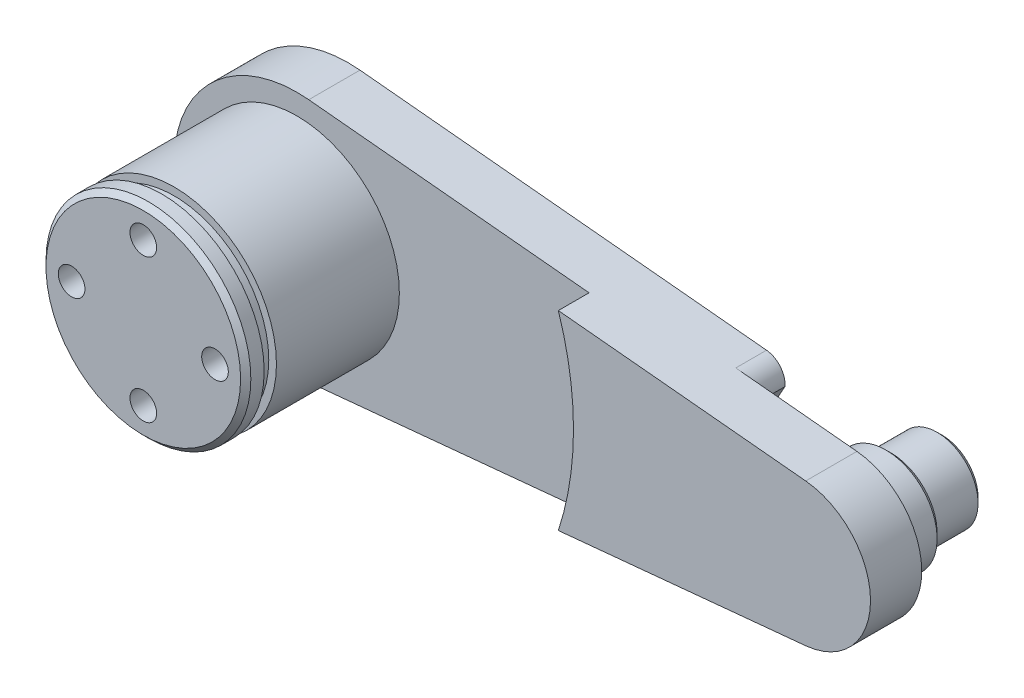
ISO-10303-21;
HEADER;
FILE_DESCRIPTION(('STEP AP214'),'2;1');
FILE_NAME('part.step','',(''),(''),'','','');
FILE_SCHEMA(('AUTOMOTIVE_DESIGN { 1 0 10303 214 1 1 1 1 }'));
ENDSEC;
DATA;
#1=APPLICATION_CONTEXT('core data for automotive mechanical design processes');
#2=APPLICATION_PROTOCOL_DEFINITION('international standard','automotive_design',2000,#1);
#3=PRODUCT_CONTEXT('',#1,'mechanical');
#4=PRODUCT('Part','Part','',(#3));
#5=PRODUCT_RELATED_PRODUCT_CATEGORY('part','',(#4));
#6=PRODUCT_DEFINITION_FORMATION('','',#4);
#7=PRODUCT_DEFINITION_CONTEXT('part definition',#1,'design');
#8=PRODUCT_DEFINITION('design','',#6,#7);
#9=PRODUCT_DEFINITION_SHAPE('','',#8);
#10=(LENGTH_UNIT() NAMED_UNIT(*) SI_UNIT(.MILLI.,.METRE.));
#11=(NAMED_UNIT(*) PLANE_ANGLE_UNIT() SI_UNIT($,.RADIAN.));
#12=(NAMED_UNIT(*) SI_UNIT($,.STERADIAN.) SOLID_ANGLE_UNIT());
#13=UNCERTAINTY_MEASURE_WITH_UNIT(LENGTH_MEASURE(1.E-05),#10,'distance_accuracy_value','');
#14=(GEOMETRIC_REPRESENTATION_CONTEXT(3) GLOBAL_UNCERTAINTY_ASSIGNED_CONTEXT((#13)) GLOBAL_UNIT_ASSIGNED_CONTEXT((#10,
#11,#12)) REPRESENTATION_CONTEXT('',''));
#15=CARTESIAN_POINT('',(0.,0.,0.));
#16=DIRECTION('',(0.,0.,1.));
#17=DIRECTION('',(1.,0.,0.));
#18=AXIS2_PLACEMENT_3D('',#15,#16,#17);
#19=CARTESIAN_POINT('',(52.,0.,-39.7212315156659));
#20=DIRECTION('',(0.,0.,1.));
#21=DIRECTION('',(1.,0.,0.));
#22=AXIS2_PLACEMENT_3D('',#19,#20,#21);
#23=CYLINDRICAL_SURFACE('',#22,11.075);
#24=CARTESIAN_POINT('',(52.,0.,3.));
#25=DIRECTION('',(0.,0.,-1.));
#26=DIRECTION('',(-1.,0.,0.));
#27=AXIS2_PLACEMENT_3D('',#24,#25,#26);
#28=CIRCLE('',#27,11.075);
#29=CARTESIAN_POINT('',(42.6444719674846,-5.92703300419511,3.));
#30=VERTEX_POINT('',#29);
#31=CARTESIAN_POINT('',(42.6444719674846,5.92703300419511,3.));
#32=VERTEX_POINT('',#31);
#33=EDGE_CURVE('E188',#30,#32,#28,.T.);
#34=ORIENTED_EDGE('',*,*,#33,.F.);
#35=DIRECTION('',(0.,0.,-1.));
#36=VECTOR('',#35,1.);
#37=CARTESIAN_POINT('',(42.6444719674846,-5.92703300419511,3.));
#38=LINE('',#37,#36);
#39=CARTESIAN_POINT('',(42.6444719674846,-5.92703300419511,0.));
#40=VERTEX_POINT('',#39);
#41=EDGE_CURVE('E235',#30,#40,#38,.T.);
#42=ORIENTED_EDGE('',*,*,#41,.T.);
#43=CARTESIAN_POINT('',(52.,0.,0.));
#44=DIRECTION('',(0.,0.,1.));
#45=DIRECTION('',(1.,0.,0.));
#46=AXIS2_PLACEMENT_3D('',#43,#44,#45);
#47=CIRCLE('',#46,11.075);
#48=CARTESIAN_POINT('',(42.6444719674846,5.92703300419511,0.));
#49=VERTEX_POINT('',#48);
#50=EDGE_CURVE('E198',#40,#49,#47,.F.);
#51=ORIENTED_EDGE('',*,*,#50,.T.);
#52=DIRECTION('',(0.,0.,-1.));
#53=VECTOR('',#52,1.);
#54=CARTESIAN_POINT('',(42.6444719674846,5.92703300419511,3.));
#55=LINE('',#54,#53);
#56=EDGE_CURVE('E231',#32,#49,#55,.T.);
#57=ORIENTED_EDGE('',*,*,#56,.F.);
#58=EDGE_LOOP('',(#34,#42,#51,#57));
#59=FACE_BOUND('',#58,.T.);
#60=ADVANCED_FACE('F51',(#59),#23,.F.);
#61=CARTESIAN_POINT('',(52.,0.,-1.));
#62=DIRECTION('',(0.,0.,-1.));
#63=DIRECTION('',(-1.,0.,0.));
#64=AXIS2_PLACEMENT_3D('',#61,#62,#63);
#65=PLANE('',#64);
#66=CARTESIAN_POINT('',(52.,0.,-1.));
#67=DIRECTION('',(0.,0.,-1.));
#68=DIRECTION('',(-1.,0.,0.));
#69=AXIS2_PLACEMENT_3D('',#66,#67,#68);
#70=CIRCLE('',#69,4.5);
#71=CARTESIAN_POINT('',(47.5,0.,-1.));
#72=VERTEX_POINT('',#71);
#73=EDGE_CURVE('E302',#72,#72,#70,.T.);
#74=ORIENTED_EDGE('',*,*,#73,.T.);
#75=EDGE_LOOP('',(#74));
#76=FACE_BOUND('',#75,.T.);
#77=CARTESIAN_POINT('',(52.,0.,-1.));
#78=DIRECTION('',(0.,0.,-1.));
#79=DIRECTION('',(-1.,0.,0.));
#80=AXIS2_PLACEMENT_3D('',#77,#78,#79);
#81=CIRCLE('',#80,4.);
#82=CARTESIAN_POINT('',(48.,0.,-1.));
#83=VERTEX_POINT('',#82);
#84=EDGE_CURVE('E254',#83,#83,#81,.T.);
#85=ORIENTED_EDGE('',*,*,#84,.F.);
#86=EDGE_LOOP('',(#85));
#87=FACE_BOUND('',#86,.T.);
#88=ADVANCED_FACE('F355',(#76,#87),#65,.T.);
#89=CARTESIAN_POINT('',(52.,0.,-1.));
#90=DIRECTION('',(0.,0.,1.));
#91=DIRECTION('',(1.,0.,0.));
#92=AXIS2_PLACEMENT_3D('',#89,#90,#91);
#93=CYLINDRICAL_SURFACE('',#92,5.);
#94=CARTESIAN_POINT('',(52.,0.,-0.500000000000003));
#95=DIRECTION('',(0.,0.,-1.));
#96=DIRECTION('',(-1.,0.,0.));
#97=AXIS2_PLACEMENT_3D('',#94,#95,#96);
#98=CIRCLE('',#97,5.);
#99=CARTESIAN_POINT('',(47.,0.,-0.500000000000003));
#100=VERTEX_POINT('',#99);
#101=EDGE_CURVE('E310',#100,#100,#98,.F.);
#102=ORIENTED_EDGE('',*,*,#101,.T.);
#103=EDGE_LOOP('',(#102));
#104=FACE_BOUND('',#103,.T.);
#105=CARTESIAN_POINT('',(52.,0.,3.));
#106=DIRECTION('',(0.,0.,-1.));
#107=DIRECTION('',(-1.,0.,0.));
#108=AXIS2_PLACEMENT_3D('',#105,#106,#107);
#109=CIRCLE('',#108,5.);
#110=CARTESIAN_POINT('',(47.,0.,3.));
#111=VERTEX_POINT('',#110);
#112=EDGE_CURVE('E230',#111,#111,#109,.F.);
#113=ORIENTED_EDGE('',*,*,#112,.F.);
#114=EDGE_LOOP('',(#113));
#115=FACE_BOUND('',#114,.T.);
#116=ADVANCED_FACE('F359',(#104,#115),#93,.T.);
#117=CARTESIAN_POINT('',(0.,0.,-6.));
#118=DIRECTION('',(0.,0.,-1.));
#119=DIRECTION('',(-1.,0.,0.));
#120=AXIS2_PLACEMENT_3D('',#117,#118,#119);
#121=PLANE('',#120);
#122=CARTESIAN_POINT('',(52.,0.,-6.));
#123=DIRECTION('',(0.,0.,-1.));
#124=DIRECTION('',(-1.,0.,0.));
#125=AXIS2_PLACEMENT_3D('',#122,#123,#124);
#126=CIRCLE('',#125,2.2);
#127=CARTESIAN_POINT('',(49.8,0.,-6.));
#128=VERTEX_POINT('',#127);
#129=EDGE_CURVE('E243',#128,#128,#126,.T.);
#130=ORIENTED_EDGE('',*,*,#129,.F.);
#131=EDGE_LOOP('',(#130));
#132=FACE_BOUND('',#131,.T.);
#133=CARTESIAN_POINT('',(52.,0.,-6.));
#134=DIRECTION('',(0.,0.,-1.));
#135=DIRECTION('',(-1.,0.,0.));
#136=AXIS2_PLACEMENT_3D('',#133,#134,#135);
#137=CIRCLE('',#136,3.5);
#138=CARTESIAN_POINT('',(48.5,0.,-6.));
#139=VERTEX_POINT('',#138);
#140=EDGE_CURVE('E309',#139,#139,#137,.T.);
#141=ORIENTED_EDGE('',*,*,#140,.T.);
#142=EDGE_LOOP('',(#141));
#143=FACE_BOUND('',#142,.T.);
#144=ADVANCED_FACE('F459',(#132,#143),#121,.T.);
#145=CARTESIAN_POINT('',(52.,0.,-6.));
#146=DIRECTION('',(0.,0.,1.));
#147=DIRECTION('',(1.,0.,0.));
#148=AXIS2_PLACEMENT_3D('',#145,#146,#147);
#149=CYLINDRICAL_SURFACE('',#148,4.);
#150=CARTESIAN_POINT('',(52.,0.,-5.50000000000001));
#151=DIRECTION('',(0.,0.,-1.));
#152=DIRECTION('',(-1.,0.,0.));
#153=AXIS2_PLACEMENT_3D('',#150,#151,#152);
#154=CIRCLE('',#153,4.);
#155=CARTESIAN_POINT('',(48.,0.,-5.50000000000001));
#156=VERTEX_POINT('',#155);
#157=EDGE_CURVE('E312',#156,#156,#154,.F.);
#158=ORIENTED_EDGE('',*,*,#157,.T.);
#159=EDGE_LOOP('',(#158));
#160=FACE_BOUND('',#159,.T.);
#161=ORIENTED_EDGE('',*,*,#84,.T.);
#162=EDGE_LOOP('',(#161));
#163=FACE_BOUND('',#162,.T.);
#164=ADVANCED_FACE('F437',(#160,#163),#149,.T.);
#165=CARTESIAN_POINT('',(52.,0.,-1.));
#166=DIRECTION('',(0.,0.,1.));
#167=DIRECTION('',(1.,0.,0.));
#168=AXIS2_PLACEMENT_3D('',#165,#166,#167);
#169=CONICAL_SURFACE('',#168,4.5,0.785398163397445);
#170=ORIENTED_EDGE('',*,*,#101,.F.);
#171=EDGE_LOOP('',(#170));
#172=FACE_BOUND('',#171,.T.);
#173=ORIENTED_EDGE('',*,*,#73,.F.);
#174=EDGE_LOOP('',(#173));
#175=FACE_BOUND('',#174,.T.);
#176=ADVANCED_FACE('F435',(#172,#175),#169,.T.);
#177=CARTESIAN_POINT('',(52.,0.,-6.));
#178=DIRECTION('',(0.,0.,1.));
#179=DIRECTION('',(1.,0.,0.));
#180=AXIS2_PLACEMENT_3D('',#177,#178,#179);
#181=CONICAL_SURFACE('',#180,3.5,0.785398163397448);
#182=ORIENTED_EDGE('',*,*,#157,.F.);
#183=EDGE_LOOP('',(#182));
#184=FACE_BOUND('',#183,.T.);
#185=ORIENTED_EDGE('',*,*,#140,.F.);
#186=EDGE_LOOP('',(#185));
#187=FACE_BOUND('',#186,.T.);
#188=ADVANCED_FACE('F438',(#184,#187),#181,.T.);
#189=CARTESIAN_POINT('',(52.,0.,4.));
#190=DIRECTION('',(0.,0.,-1.));
#191=DIRECTION('',(-1.,0.,0.));
#192=AXIS2_PLACEMENT_3D('',#189,#190,#191);
#193=CYLINDRICAL_SURFACE('',#192,2.2);
#194=CARTESIAN_POINT('',(52.,0.,4.));
#195=DIRECTION('',(0.,0.,-1.));
#196=DIRECTION('',(-1.,0.,0.));
#197=AXIS2_PLACEMENT_3D('',#194,#195,#196);
#198=CIRCLE('',#197,2.2);
#199=CARTESIAN_POINT('',(49.8,0.,4.));
#200=VERTEX_POINT('',#199);
#201=EDGE_CURVE('E242',#200,#200,#198,.T.);
#202=ORIENTED_EDGE('',*,*,#201,.F.);
#203=EDGE_LOOP('',(#202));
#204=FACE_BOUND('',#203,.T.);
#205=ORIENTED_EDGE('',*,*,#129,.T.);
#206=EDGE_LOOP('',(#205));
#207=FACE_BOUND('',#206,.T.);
#208=ADVANCED_FACE('F443',(#204,#207),#193,.F.);
#209=CARTESIAN_POINT('',(52.,0.,4.));
#210=DIRECTION('',(0.,0.,-1.));
#211=DIRECTION('',(-1.,0.,0.));
#212=AXIS2_PLACEMENT_3D('',#209,#210,#211);
#213=PLANE('',#212);
#214=ORIENTED_EDGE('',*,*,#201,.T.);
#215=EDGE_LOOP('',(#214));
#216=FACE_BOUND('',#215,.T.);
#217=ADVANCED_FACE('F448',(#216),#213,.T.);
#218=CARTESIAN_POINT('',(0.,0.,3.));
#219=DIRECTION('',(0.,0.,-1.));
#220=DIRECTION('',(-1.,0.,0.));
#221=AXIS2_PLACEMENT_3D('',#218,#219,#220);
#222=PLANE('',#221);
#223=ORIENTED_EDGE('',*,*,#33,.T.);
#224=CARTESIAN_POINT('',(40.6537389990834,6.1193406965028,3.));
#225=DIRECTION('',(0.,0.,-1.));
#226=DIRECTION('',(-1.,0.,0.));
#227=AXIS2_PLACEMENT_3D('',#224,#225,#226);
#228=CIRCLE('',#227,2.);
#229=CARTESIAN_POINT('',(40.8460466913911,8.11007366490396,3.));
#230=VERTEX_POINT('',#229);
#231=EDGE_CURVE('E11',#32,#230,#228,.F.);
#232=ORIENTED_EDGE('',*,*,#231,.T.);
#233=DIRECTION('',(-0.99536648420058,0.0961538461538461,0.));
#234=VECTOR('',#233,1.);
#235=CARTESIAN_POINT('',(1.15384615384615,11.944397810407,3.));
#236=LINE('',#235,#234);
#237=CARTESIAN_POINT('',(52.6730769230769,6.96756538940406,3.));
#238=VERTEX_POINT('',#237);
#239=EDGE_CURVE('E236',#238,#230,#236,.T.);
#240=ORIENTED_EDGE('',*,*,#239,.F.);
#241=CARTESIAN_POINT('',(52.,0.,3.));
#242=DIRECTION('',(0.,0.,-1.));
#243=DIRECTION('',(-1.,0.,0.));
#244=AXIS2_PLACEMENT_3D('',#241,#242,#243);
#245=CIRCLE('',#244,7.);
#246=CARTESIAN_POINT('',(52.6730769230769,-6.96756538940406,3.));
#247=VERTEX_POINT('',#246);
#248=EDGE_CURVE('E162',#238,#247,#245,.T.);
#249=ORIENTED_EDGE('',*,*,#248,.T.);
#250=DIRECTION('',(-0.99536648420058,-0.0961538461538461,0.));
#251=VECTOR('',#250,1.);
#252=CARTESIAN_POINT('',(1.15384615384615,-11.944397810407,3.));
#253=LINE('',#252,#251);
#254=CARTESIAN_POINT('',(40.8460466913911,-8.11007366490396,3.));
#255=VERTEX_POINT('',#254);
#256=EDGE_CURVE('E241',#247,#255,#253,.T.);
#257=ORIENTED_EDGE('',*,*,#256,.T.);
#258=CARTESIAN_POINT('',(40.6537389990834,-6.1193406965028,3.));
#259=DIRECTION('',(0.,0.,-1.));
#260=DIRECTION('',(-1.,0.,0.));
#261=AXIS2_PLACEMENT_3D('',#258,#259,#260);
#262=CIRCLE('',#261,2.);
#263=EDGE_CURVE('E58',#255,#30,#262,.F.);
#264=ORIENTED_EDGE('',*,*,#263,.T.);
#265=EDGE_LOOP('',(#223,#232,#240,#249,#257,#264));
#266=FACE_BOUND('',#265,.T.);
#267=ORIENTED_EDGE('',*,*,#112,.T.);
#268=EDGE_LOOP('',(#267));
#269=FACE_BOUND('',#268,.T.);
#270=ADVANCED_FACE('F471',(#266,#269),#222,.T.);
#271=CARTESIAN_POINT('',(0.,0.,20.));
#272=DIRECTION('',(0.,0.,-1.));
#273=DIRECTION('',(-1.,0.,0.));
#274=AXIS2_PLACEMENT_3D('',#271,#272,#273);
#275=CYLINDRICAL_SURFACE('',#274,10.);
#276=CARTESIAN_POINT('',(0.,0.,17.));
#277=DIRECTION('',(0.,0.,-1.));
#278=DIRECTION('',(-1.,0.,0.));
#279=AXIS2_PLACEMENT_3D('',#276,#277,#278);
#280=CIRCLE('',#279,10.);
#281=CARTESIAN_POINT('',(-10.,0.,17.));
#282=VERTEX_POINT('',#281);
#283=EDGE_CURVE('E226',#282,#282,#280,.T.);
#284=ORIENTED_EDGE('',*,*,#283,.T.);
#285=EDGE_LOOP('',(#284));
#286=FACE_BOUND('',#285,.T.);
#287=CARTESIAN_POINT('',(0.,0.,5.));
#288=DIRECTION('',(0.,0.,1.));
#289=DIRECTION('',(1.,0.,0.));
#290=AXIS2_PLACEMENT_3D('',#287,#288,#289);
#291=CIRCLE('',#290,10.);
#292=CARTESIAN_POINT('',(10.,0.,5.));
#293=VERTEX_POINT('',#292);
#294=EDGE_CURVE('E280',#293,#293,#291,.T.);
#295=ORIENTED_EDGE('',*,*,#294,.T.);
#296=EDGE_LOOP('',(#295));
#297=FACE_BOUND('',#296,.T.);
#298=ADVANCED_FACE('F390',(#286,#297),#275,.T.);
#299=CARTESIAN_POINT('',(0.,0.,5.));
#300=DIRECTION('',(0.,0.,-1.));
#301=DIRECTION('',(-1.,0.,0.));
#302=AXIS2_PLACEMENT_3D('',#299,#300,#301);
#303=CYLINDRICAL_SURFACE('',#302,12.);
#304=DIRECTION('',(0.,0.,-1.));
#305=VECTOR('',#304,1.);
#306=CARTESIAN_POINT('',(1.15384615384615,11.944397810407,5.));
#307=LINE('',#306,#305);
#308=CARTESIAN_POINT('',(1.15384615384615,11.944397810407,5.));
#309=VERTEX_POINT('',#308);
#310=CARTESIAN_POINT('',(1.15384615384615,11.944397810407,0.));
#311=VERTEX_POINT('',#310);
#312=EDGE_CURVE('E168',#309,#311,#307,.T.);
#313=ORIENTED_EDGE('',*,*,#312,.T.);
#314=CARTESIAN_POINT('',(0.,0.,0.));
#315=DIRECTION('',(0.,0.,1.));
#316=DIRECTION('',(1.,0.,0.));
#317=AXIS2_PLACEMENT_3D('',#314,#315,#316);
#318=CIRCLE('',#317,12.);
#319=CARTESIAN_POINT('',(1.15384615384615,-11.944397810407,0.));
#320=VERTEX_POINT('',#319);
#321=EDGE_CURVE('E285',#311,#320,#318,.T.);
#322=ORIENTED_EDGE('',*,*,#321,.T.);
#323=DIRECTION('',(0.,0.,-1.));
#324=VECTOR('',#323,1.);
#325=CARTESIAN_POINT('',(1.15384615384615,-11.944397810407,5.));
#326=LINE('',#325,#324);
#327=CARTESIAN_POINT('',(1.15384615384615,-11.944397810407,5.));
#328=VERTEX_POINT('',#327);
#329=EDGE_CURVE('E288',#328,#320,#326,.T.);
#330=ORIENTED_EDGE('',*,*,#329,.F.);
#331=CARTESIAN_POINT('',(0.,0.,5.));
#332=DIRECTION('',(0.,0.,1.));
#333=DIRECTION('',(1.,0.,0.));
#334=AXIS2_PLACEMENT_3D('',#331,#332,#333);
#335=CIRCLE('',#334,12.);
#336=EDGE_CURVE('E287',#309,#328,#335,.T.);
#337=ORIENTED_EDGE('',*,*,#336,.F.);
#338=EDGE_LOOP('',(#313,#322,#330,#337));
#339=FACE_BOUND('',#338,.T.);
#340=ADVANCED_FACE('F417',(#339),#303,.T.);
#341=CARTESIAN_POINT('',(0.,0.,5.));
#342=DIRECTION('',(0.,0.,1.));
#343=DIRECTION('',(1.,0.,0.));
#344=AXIS2_PLACEMENT_3D('',#341,#342,#343);
#345=PLANE('',#344);
#346=CARTESIAN_POINT('',(0.,0.,5.));
#347=DIRECTION('',(0.,0.,-1.));
#348=DIRECTION('',(1.,0.,0.));
#349=AXIS2_PLACEMENT_3D('',#346,#347,#348);
#350=CIRCLE('',#349,30.);
#351=CARTESIAN_POINT('',(28.5218997022735,9.30060414024013,5.));
#352=VERTEX_POINT('',#351);
#353=CARTESIAN_POINT('',(28.5218997022735,-9.30060414024012,5.));
#354=VERTEX_POINT('',#353);
#355=EDGE_CURVE('E67',#352,#354,#350,.T.);
#356=ORIENTED_EDGE('',*,*,#355,.F.);
#357=DIRECTION('',(0.99536648420058,-0.0961538461538461,0.));
#358=VECTOR('',#357,1.);
#359=CARTESIAN_POINT('',(1.15384615384615,11.944397810407,5.));
#360=LINE('',#359,#358);
#361=EDGE_CURVE('E282',#309,#352,#360,.T.);
#362=ORIENTED_EDGE('',*,*,#361,.F.);
#363=ORIENTED_EDGE('',*,*,#336,.T.);
#364=DIRECTION('',(0.99536648420058,0.0961538461538461,0.));
#365=VECTOR('',#364,1.);
#366=CARTESIAN_POINT('',(1.15384615384615,-11.944397810407,5.));
#367=LINE('',#366,#365);
#368=EDGE_CURVE('E283',#328,#354,#367,.T.);
#369=ORIENTED_EDGE('',*,*,#368,.T.);
#370=EDGE_LOOP('',(#356,#362,#363,#369));
#371=FACE_BOUND('',#370,.T.);
#372=ORIENTED_EDGE('',*,*,#294,.F.);
#373=EDGE_LOOP('',(#372));
#374=FACE_BOUND('',#373,.T.);
#375=ADVANCED_FACE('F411',(#371,#374),#345,.T.);
#376=CARTESIAN_POINT('',(1.15384615384615,11.944397810407,5.));
#377=DIRECTION('',(0.0961538461538461,0.99536648420058,0.));
#378=DIRECTION('',(-0.99536648420058,0.0961538461538461,0.));
#379=AXIS2_PLACEMENT_3D('',#376,#377,#378);
#380=PLANE('',#379);
#381=ORIENTED_EDGE('',*,*,#239,.T.);
#382=DIRECTION('',(0.,0.,1.));
#383=VECTOR('',#382,1.);
#384=CARTESIAN_POINT('',(40.8460466913911,8.11007366490396,0.));
#385=LINE('',#384,#383);
#386=CARTESIAN_POINT('',(40.8460466913911,8.11007366490396,0.));
#387=VERTEX_POINT('',#386);
#388=EDGE_CURVE('E321',#230,#387,#385,.F.);
#389=ORIENTED_EDGE('',*,*,#388,.T.);
#390=DIRECTION('',(0.99536648420058,-0.0961538461538461,0.));
#391=VECTOR('',#390,1.);
#392=CARTESIAN_POINT('',(1.15384615384615,11.944397810407,0.));
#393=LINE('',#392,#391);
#394=EDGE_CURVE('E293',#311,#387,#393,.T.);
#395=ORIENTED_EDGE('',*,*,#394,.F.);
#396=ORIENTED_EDGE('',*,*,#312,.F.);
#397=ORIENTED_EDGE('',*,*,#361,.T.);
#398=DIRECTION('',(0.,0.,-1.));
#399=VECTOR('',#398,1.);
#400=CARTESIAN_POINT('',(28.5218997022735,9.30060414024013,8.));
#401=LINE('',#400,#399);
#402=CARTESIAN_POINT('',(28.5218997022735,9.30060414024013,8.));
#403=VERTEX_POINT('',#402);
#404=EDGE_CURVE('E175',#403,#352,#401,.T.);
#405=ORIENTED_EDGE('',*,*,#404,.F.);
#406=DIRECTION('',(-0.99536648420058,0.096153846153846,0.));
#407=VECTOR('',#406,1.);
#408=CARTESIAN_POINT('',(52.6730769230769,6.96756538940406,8.));
#409=LINE('',#408,#407);
#410=CARTESIAN_POINT('',(52.6730769230769,6.96756538940406,8.));
#411=VERTEX_POINT('',#410);
#412=EDGE_CURVE('E169',#411,#403,#409,.T.);
#413=ORIENTED_EDGE('',*,*,#412,.F.);
#414=DIRECTION('',(0.,0.,-1.));
#415=VECTOR('',#414,1.);
#416=CARTESIAN_POINT('',(52.6730769230769,6.96756538940406,5.));
#417=LINE('',#416,#415);
#418=EDGE_CURVE('E157',#411,#238,#417,.T.);
#419=ORIENTED_EDGE('',*,*,#418,.T.);
#420=EDGE_LOOP('',(#381,#389,#395,#396,#397,#405,#413,#419));
#421=FACE_BOUND('',#420,.T.);
#422=ADVANCED_FACE('F167',(#421),#380,.T.);
#423=CARTESIAN_POINT('',(52.,0.,5.));
#424=DIRECTION('',(0.,0.,-1.));
#425=DIRECTION('',(-1.,0.,0.));
#426=AXIS2_PLACEMENT_3D('',#423,#424,#425);
#427=CYLINDRICAL_SURFACE('',#426,7.);
#428=DIRECTION('',(0.,0.,-1.));
#429=VECTOR('',#428,1.);
#430=CARTESIAN_POINT('',(52.6730769230769,-6.96756538940406,5.));
#431=LINE('',#430,#429);
#432=CARTESIAN_POINT('',(52.6730769230769,-6.96756538940406,8.));
#433=VERTEX_POINT('',#432);
#434=EDGE_CURVE('E164',#433,#247,#431,.T.);
#435=ORIENTED_EDGE('',*,*,#434,.T.);
#436=ORIENTED_EDGE('',*,*,#248,.F.);
#437=ORIENTED_EDGE('',*,*,#418,.F.);
#438=CARTESIAN_POINT('',(52.,0.,8.));
#439=DIRECTION('',(0.,0.,1.));
#440=DIRECTION('',(1.,0.,0.));
#441=AXIS2_PLACEMENT_3D('',#438,#439,#440);
#442=CIRCLE('',#441,7.);
#443=EDGE_CURVE('E156',#433,#411,#442,.T.);
#444=ORIENTED_EDGE('',*,*,#443,.F.);
#445=EDGE_LOOP('',(#435,#436,#437,#444));
#446=FACE_BOUND('',#445,.T.);
#447=ADVANCED_FACE('F158',(#446),#427,.T.);
#448=CARTESIAN_POINT('',(1.15384615384615,-11.944397810407,5.));
#449=DIRECTION('',(-0.0961538461538461,0.99536648420058,0.));
#450=DIRECTION('',(-0.99536648420058,-0.0961538461538461,0.));
#451=AXIS2_PLACEMENT_3D('',#448,#449,#450);
#452=PLANE('',#451);
#453=DIRECTION('',(0.99536648420058,0.0961538461538461,0.));
#454=VECTOR('',#453,1.);
#455=CARTESIAN_POINT('',(1.15384615384615,-11.944397810407,0.));
#456=LINE('',#455,#454);
#457=CARTESIAN_POINT('',(40.8460466913911,-8.11007366490396,0.));
#458=VERTEX_POINT('',#457);
#459=EDGE_CURVE('E278',#320,#458,#456,.T.);
#460=ORIENTED_EDGE('',*,*,#459,.T.);
#461=DIRECTION('',(0.,0.,-1.));
#462=VECTOR('',#461,1.);
#463=CARTESIAN_POINT('',(40.8460466913911,-8.11007366490396,5.));
#464=LINE('',#463,#462);
#465=EDGE_CURVE('E317',#458,#255,#464,.F.);
#466=ORIENTED_EDGE('',*,*,#465,.T.);
#467=ORIENTED_EDGE('',*,*,#256,.F.);
#468=ORIENTED_EDGE('',*,*,#434,.F.);
#469=DIRECTION('',(0.99536648420058,0.096153846153846,0.));
#470=VECTOR('',#469,1.);
#471=CARTESIAN_POINT('',(28.5218997022735,-9.30060414024012,8.));
#472=LINE('',#471,#470);
#473=CARTESIAN_POINT('',(28.5218997022735,-9.30060414024012,8.));
#474=VERTEX_POINT('',#473);
#475=EDGE_CURVE('E179',#474,#433,#472,.T.);
#476=ORIENTED_EDGE('',*,*,#475,.F.);
#477=DIRECTION('',(0.,0.,-1.));
#478=VECTOR('',#477,1.);
#479=CARTESIAN_POINT('',(28.5218997022735,-9.30060414024012,8.));
#480=LINE('',#479,#478);
#481=EDGE_CURVE('E184',#474,#354,#480,.T.);
#482=ORIENTED_EDGE('',*,*,#481,.T.);
#483=ORIENTED_EDGE('',*,*,#368,.F.);
#484=ORIENTED_EDGE('',*,*,#329,.T.);
#485=EDGE_LOOP('',(#460,#466,#467,#468,#476,#482,#483,#484));
#486=FACE_BOUND('',#485,.T.);
#487=ADVANCED_FACE('F405',(#486),#452,.F.);
#488=CARTESIAN_POINT('',(0.,0.,0.));
#489=DIRECTION('',(0.,0.,1.));
#490=DIRECTION('',(1.,0.,0.));
#491=AXIS2_PLACEMENT_3D('',#488,#489,#490);
#492=PLANE('',#491);
#493=ORIENTED_EDGE('',*,*,#50,.F.);
#494=CARTESIAN_POINT('',(40.6537389990834,-6.1193406965028,0.));
#495=DIRECTION('',(0.,0.,1.));
#496=DIRECTION('',(1.,0.,0.));
#497=AXIS2_PLACEMENT_3D('',#494,#495,#496);
#498=CIRCLE('',#497,2.);
#499=EDGE_CURVE('E323',#40,#458,#498,.F.);
#500=ORIENTED_EDGE('',*,*,#499,.T.);
#501=ORIENTED_EDGE('',*,*,#459,.F.);
#502=ORIENTED_EDGE('',*,*,#321,.F.);
#503=ORIENTED_EDGE('',*,*,#394,.T.);
#504=CARTESIAN_POINT('',(40.6537389990834,6.1193406965028,0.));
#505=DIRECTION('',(0.,0.,1.));
#506=DIRECTION('',(1.,0.,0.));
#507=AXIS2_PLACEMENT_3D('',#504,#505,#506);
#508=CIRCLE('',#507,2.);
#509=EDGE_CURVE('E316',#387,#49,#508,.F.);
#510=ORIENTED_EDGE('',*,*,#509,.T.);
#511=EDGE_LOOP('',(#493,#500,#501,#502,#503,#510));
#512=FACE_BOUND('',#511,.T.);
#513=DIRECTION('',(-0.99536648420058,0.0961538461538463,0.));
#514=VECTOR('',#513,1.);
#515=CARTESIAN_POINT('',(15.3405939053912,4.54600688845431,0.));
#516=LINE('',#515,#514);
#517=CARTESIAN_POINT('',(38.6444719674846,2.2948184653579,0.));
#518=VERTEX_POINT('',#517);
#519=CARTESIAN_POINT('',(15.3405939053912,4.54600688845431,0.));
#520=VERTEX_POINT('',#519);
#521=EDGE_CURVE('E210',#518,#520,#516,.T.);
#522=ORIENTED_EDGE('',*,*,#521,.T.);
#523=CARTESIAN_POINT('',(0.,0.,0.));
#524=DIRECTION('',(0.,0.,1.));
#525=DIRECTION('',(1.,0.,0.));
#526=AXIS2_PLACEMENT_3D('',#523,#524,#525);
#527=CIRCLE('',#526,16.);
#528=CARTESIAN_POINT('',(15.3405939053912,-4.54600688845431,0.));
#529=VERTEX_POINT('',#528);
#530=EDGE_CURVE('E204',#520,#529,#527,.F.);
#531=ORIENTED_EDGE('',*,*,#530,.T.);
#532=DIRECTION('',(0.99536648420058,0.0961538461538462,0.));
#533=VECTOR('',#532,1.);
#534=CARTESIAN_POINT('',(38.6444719674846,-2.2948184653579,0.));
#535=LINE('',#534,#533);
#536=CARTESIAN_POINT('',(38.6444719674846,-2.2948184653579,0.));
#537=VERTEX_POINT('',#536);
#538=EDGE_CURVE('E207',#529,#537,#535,.T.);
#539=ORIENTED_EDGE('',*,*,#538,.T.);
#540=DIRECTION('',(0.,1.,0.));
#541=VECTOR('',#540,1.);
#542=CARTESIAN_POINT('',(38.6444719674846,2.2948184653579,0.));
#543=LINE('',#542,#541);
#544=EDGE_CURVE('E220',#537,#518,#543,.T.);
#545=ORIENTED_EDGE('',*,*,#544,.T.);
#546=EDGE_LOOP('',(#522,#531,#539,#545));
#547=FACE_BOUND('',#546,.T.);
#548=ADVANCED_FACE('F396',(#512,#547),#492,.F.);
#549=CARTESIAN_POINT('',(40.6537389990834,-6.1193406965028,3.));
#550=DIRECTION('',(0.,0.,-1.));
#551=DIRECTION('',(-1.,0.,0.));
#552=AXIS2_PLACEMENT_3D('',#549,#550,#551);
#553=CYLINDRICAL_SURFACE('',#552,2.);
#554=ORIENTED_EDGE('',*,*,#499,.F.);
#555=ORIENTED_EDGE('',*,*,#41,.F.);
#556=ORIENTED_EDGE('',*,*,#263,.F.);
#557=ORIENTED_EDGE('',*,*,#465,.F.);
#558=EDGE_LOOP('',(#554,#555,#556,#557));
#559=FACE_BOUND('',#558,.T.);
#560=ADVANCED_FACE('F347',(#559),#553,.T.);
#561=CARTESIAN_POINT('',(40.6537389990834,6.1193406965028,3.));
#562=DIRECTION('',(0.,0.,-1.));
#563=DIRECTION('',(-1.,0.,0.));
#564=AXIS2_PLACEMENT_3D('',#561,#562,#563);
#565=CYLINDRICAL_SURFACE('',#564,2.);
#566=ORIENTED_EDGE('',*,*,#509,.F.);
#567=ORIENTED_EDGE('',*,*,#388,.F.);
#568=ORIENTED_EDGE('',*,*,#231,.F.);
#569=ORIENTED_EDGE('',*,*,#56,.T.);
#570=EDGE_LOOP('',(#566,#567,#568,#569));
#571=FACE_BOUND('',#570,.T.);
#572=ADVANCED_FACE('F52',(#571),#565,.T.);
#573=CARTESIAN_POINT('',(9.25,0.,18.2));
#574=DIRECTION('',(0.,0.,1.));
#575=DIRECTION('',(1.,0.,0.));
#576=AXIS2_PLACEMENT_3D('',#573,#574,#575);
#577=PLANE('',#576);
#578=CARTESIAN_POINT('',(0.,0.,18.2));
#579=DIRECTION('',(0.,0.,1.));
#580=DIRECTION('',(1.,0.,0.));
#581=AXIS2_PLACEMENT_3D('',#578,#579,#580);
#582=CIRCLE('',#581,9.25);
#583=CARTESIAN_POINT('',(9.25,0.,18.2));
#584=VERTEX_POINT('',#583);
#585=EDGE_CURVE('E221',#584,#584,#582,.T.);
#586=ORIENTED_EDGE('',*,*,#585,.T.);
#587=EDGE_LOOP('',(#586));
#588=FACE_BOUND('',#587,.T.);
#589=CARTESIAN_POINT('',(0.,0.,18.2));
#590=DIRECTION('',(0.,0.,1.));
#591=DIRECTION('',(1.,0.,0.));
#592=AXIS2_PLACEMENT_3D('',#589,#590,#591);
#593=CIRCLE('',#592,10.);
#594=CARTESIAN_POINT('',(10.,0.,18.2));
#595=VERTEX_POINT('',#594);
#596=EDGE_CURVE('E54',#595,#595,#593,.T.);
#597=ORIENTED_EDGE('',*,*,#596,.F.);
#598=EDGE_LOOP('',(#597));
#599=FACE_BOUND('',#598,.T.);
#600=ADVANCED_FACE('F331',(#588,#599),#577,.F.);
#601=CARTESIAN_POINT('',(9.25,0.,17.));
#602=DIRECTION('',(0.,0.,-1.));
#603=DIRECTION('',(-1.,0.,0.));
#604=AXIS2_PLACEMENT_3D('',#601,#602,#603);
#605=PLANE('',#604);
#606=CARTESIAN_POINT('',(0.,0.,17.));
#607=DIRECTION('',(0.,0.,1.));
#608=DIRECTION('',(1.,0.,0.));
#609=AXIS2_PLACEMENT_3D('',#606,#607,#608);
#610=CIRCLE('',#609,9.25);
#611=CARTESIAN_POINT('',(9.25,0.,17.));
#612=VERTEX_POINT('',#611);
#613=EDGE_CURVE('E222',#612,#612,#610,.T.);
#614=ORIENTED_EDGE('',*,*,#613,.F.);
#615=EDGE_LOOP('',(#614));
#616=FACE_BOUND('',#615,.T.);
#617=ORIENTED_EDGE('',*,*,#283,.F.);
#618=EDGE_LOOP('',(#617));
#619=FACE_BOUND('',#618,.T.);
#620=ADVANCED_FACE('F340',(#616,#619),#605,.F.);
#621=CARTESIAN_POINT('',(0.,0.,20.));
#622=DIRECTION('',(0.,0.,1.));
#623=DIRECTION('',(1.,0.,0.));
#624=AXIS2_PLACEMENT_3D('',#621,#622,#623);
#625=CYLINDRICAL_SURFACE('',#624,9.25);
#626=ORIENTED_EDGE('',*,*,#585,.F.);
#627=EDGE_LOOP('',(#626));
#628=FACE_BOUND('',#627,.T.);
#629=ORIENTED_EDGE('',*,*,#613,.T.);
#630=EDGE_LOOP('',(#629));
#631=FACE_BOUND('',#630,.T.);
#632=ADVANCED_FACE('F344',(#628,#631),#625,.T.);
#633=CARTESIAN_POINT('',(-7.,0.,14.));
#634=DIRECTION('',(0.,0.,1.));
#635=DIRECTION('',(1.,0.,0.));
#636=AXIS2_PLACEMENT_3D('',#633,#634,#635);
#637=PLANE('',#636);
#638=CARTESIAN_POINT('',(-7.,0.,14.));
#639=DIRECTION('',(0.,0.,1.));
#640=DIRECTION('',(1.,0.,0.));
#641=AXIS2_PLACEMENT_3D('',#638,#639,#640);
#642=CIRCLE('',#641,1.3);
#643=CARTESIAN_POINT('',(-5.7,0.,14.));
#644=VERTEX_POINT('',#643);
#645=EDGE_CURVE('E250',#644,#644,#642,.T.);
#646=ORIENTED_EDGE('',*,*,#645,.T.);
#647=EDGE_LOOP('',(#646));
#648=FACE_BOUND('',#647,.T.);
#649=ADVANCED_FACE('F546',(#648),#637,.T.);
#650=CARTESIAN_POINT('',(0.,-7.,14.));
#651=DIRECTION('',(0.,0.,1.));
#652=DIRECTION('',(1.,0.,0.));
#653=AXIS2_PLACEMENT_3D('',#650,#651,#652);
#654=PLANE('',#653);
#655=CARTESIAN_POINT('',(0.,-7.,14.));
#656=DIRECTION('',(0.,0.,1.));
#657=DIRECTION('',(1.,0.,0.));
#658=AXIS2_PLACEMENT_3D('',#655,#656,#657);
#659=CIRCLE('',#658,1.3);
#660=CARTESIAN_POINT('',(1.29999999999995,-7.,14.));
#661=VERTEX_POINT('',#660);
#662=EDGE_CURVE('E267',#661,#661,#659,.T.);
#663=ORIENTED_EDGE('',*,*,#662,.T.);
#664=EDGE_LOOP('',(#663));
#665=FACE_BOUND('',#664,.T.);
#666=ADVANCED_FACE('F648',(#665),#654,.T.);
#667=CARTESIAN_POINT('',(7.,0.,14.));
#668=DIRECTION('',(0.,0.,1.));
#669=DIRECTION('',(1.,0.,0.));
#670=AXIS2_PLACEMENT_3D('',#667,#668,#669);
#671=PLANE('',#670);
#672=CARTESIAN_POINT('',(7.,0.,14.));
#673=DIRECTION('',(0.,0.,1.));
#674=DIRECTION('',(1.,0.,0.));
#675=AXIS2_PLACEMENT_3D('',#672,#673,#674);
#676=CIRCLE('',#675,1.3);
#677=CARTESIAN_POINT('',(8.3,0.,14.));
#678=VERTEX_POINT('',#677);
#679=EDGE_CURVE('E257',#678,#678,#676,.T.);
#680=ORIENTED_EDGE('',*,*,#679,.T.);
#681=EDGE_LOOP('',(#680));
#682=FACE_BOUND('',#681,.T.);
#683=ADVANCED_FACE('F628',(#682),#671,.T.);
#684=CARTESIAN_POINT('',(0.,7.,14.));
#685=DIRECTION('',(0.,0.,1.));
#686=DIRECTION('',(1.,0.,0.));
#687=AXIS2_PLACEMENT_3D('',#684,#685,#686);
#688=PLANE('',#687);
#689=CARTESIAN_POINT('',(0.,7.,14.));
#690=DIRECTION('',(0.,0.,1.));
#691=DIRECTION('',(1.,0.,0.));
#692=AXIS2_PLACEMENT_3D('',#689,#690,#691);
#693=CIRCLE('',#692,1.3);
#694=CARTESIAN_POINT('',(1.3,7.,14.));
#695=VERTEX_POINT('',#694);
#696=EDGE_CURVE('E249',#695,#695,#693,.T.);
#697=ORIENTED_EDGE('',*,*,#696,.T.);
#698=EDGE_LOOP('',(#697));
#699=FACE_BOUND('',#698,.T.);
#700=ADVANCED_FACE('F621',(#699),#688,.T.);
#701=CARTESIAN_POINT('',(-7.,0.,14.));
#702=DIRECTION('',(0.,0.,1.));
#703=DIRECTION('',(1.,0.,0.));
#704=AXIS2_PLACEMENT_3D('',#701,#702,#703);
#705=CYLINDRICAL_SURFACE('',#704,1.3);
#706=ORIENTED_EDGE('',*,*,#645,.F.);
#707=EDGE_LOOP('',(#706));
#708=FACE_BOUND('',#707,.T.);
#709=CARTESIAN_POINT('',(-7.,0.,20.));
#710=DIRECTION('',(0.,0.,1.));
#711=DIRECTION('',(1.,0.,0.));
#712=AXIS2_PLACEMENT_3D('',#709,#710,#711);
#713=CIRCLE('',#712,1.3);
#714=CARTESIAN_POINT('',(-5.7,0.,20.));
#715=VERTEX_POINT('',#714);
#716=EDGE_CURVE('E269',#715,#715,#713,.T.);
#717=ORIENTED_EDGE('',*,*,#716,.T.);
#718=EDGE_LOOP('',(#717));
#719=FACE_BOUND('',#718,.T.);
#720=ADVANCED_FACE('F630',(#708,#719),#705,.F.);
#721=CARTESIAN_POINT('',(0.,-7.,14.));
#722=DIRECTION('',(0.,0.,1.));
#723=DIRECTION('',(1.,0.,0.));
#724=AXIS2_PLACEMENT_3D('',#721,#722,#723);
#725=CYLINDRICAL_SURFACE('',#724,1.3);
#726=ORIENTED_EDGE('',*,*,#662,.F.);
#727=EDGE_LOOP('',(#726));
#728=FACE_BOUND('',#727,.T.);
#729=CARTESIAN_POINT('',(0.,-7.,20.));
#730=DIRECTION('',(0.,0.,1.));
#731=DIRECTION('',(1.,0.,0.));
#732=AXIS2_PLACEMENT_3D('',#729,#730,#731);
#733=CIRCLE('',#732,1.3);
#734=CARTESIAN_POINT('',(1.29999999999995,-7.,20.));
#735=VERTEX_POINT('',#734);
#736=EDGE_CURVE('E262',#735,#735,#733,.T.);
#737=ORIENTED_EDGE('',*,*,#736,.T.);
#738=EDGE_LOOP('',(#737));
#739=FACE_BOUND('',#738,.T.);
#740=ADVANCED_FACE('F651',(#728,#739),#725,.F.);
#741=CARTESIAN_POINT('',(7.,0.,14.));
#742=DIRECTION('',(0.,0.,1.));
#743=DIRECTION('',(1.,0.,0.));
#744=AXIS2_PLACEMENT_3D('',#741,#742,#743);
#745=CYLINDRICAL_SURFACE('',#744,1.3);
#746=ORIENTED_EDGE('',*,*,#679,.F.);
#747=EDGE_LOOP('',(#746));
#748=FACE_BOUND('',#747,.T.);
#749=CARTESIAN_POINT('',(7.,0.,20.));
#750=DIRECTION('',(0.,0.,1.));
#751=DIRECTION('',(1.,0.,0.));
#752=AXIS2_PLACEMENT_3D('',#749,#750,#751);
#753=CIRCLE('',#752,1.3);
#754=CARTESIAN_POINT('',(8.3,0.,20.));
#755=VERTEX_POINT('',#754);
#756=EDGE_CURVE('E260',#755,#755,#753,.T.);
#757=ORIENTED_EDGE('',*,*,#756,.T.);
#758=EDGE_LOOP('',(#757));
#759=FACE_BOUND('',#758,.T.);
#760=ADVANCED_FACE('F640',(#748,#759),#745,.F.);
#761=CARTESIAN_POINT('',(0.,7.,14.));
#762=DIRECTION('',(0.,0.,1.));
#763=DIRECTION('',(1.,0.,0.));
#764=AXIS2_PLACEMENT_3D('',#761,#762,#763);
#765=CYLINDRICAL_SURFACE('',#764,1.3);
#766=ORIENTED_EDGE('',*,*,#696,.F.);
#767=EDGE_LOOP('',(#766));
#768=FACE_BOUND('',#767,.T.);
#769=CARTESIAN_POINT('',(0.,7.,20.));
#770=DIRECTION('',(0.,0.,1.));
#771=DIRECTION('',(1.,0.,0.));
#772=AXIS2_PLACEMENT_3D('',#769,#770,#771);
#773=CIRCLE('',#772,1.3);
#774=CARTESIAN_POINT('',(1.3,7.,20.));
#775=VERTEX_POINT('',#774);
#776=EDGE_CURVE('E251',#775,#775,#773,.T.);
#777=ORIENTED_EDGE('',*,*,#776,.T.);
#778=EDGE_LOOP('',(#777));
#779=FACE_BOUND('',#778,.T.);
#780=ADVANCED_FACE('F473',(#768,#779),#765,.F.);
#781=CARTESIAN_POINT('',(0.,0.,20.));
#782=DIRECTION('',(0.,0.,1.));
#783=DIRECTION('',(1.,0.,0.));
#784=AXIS2_PLACEMENT_3D('',#781,#782,#783);
#785=PLANE('',#784);
#786=ORIENTED_EDGE('',*,*,#776,.F.);
#787=EDGE_LOOP('',(#786));
#788=FACE_BOUND('',#787,.T.);
#789=ORIENTED_EDGE('',*,*,#756,.F.);
#790=EDGE_LOOP('',(#789));
#791=FACE_BOUND('',#790,.T.);
#792=ORIENTED_EDGE('',*,*,#736,.F.);
#793=EDGE_LOOP('',(#792));
#794=FACE_BOUND('',#793,.T.);
#795=ORIENTED_EDGE('',*,*,#716,.F.);
#796=EDGE_LOOP('',(#795));
#797=FACE_BOUND('',#796,.T.);
#798=CARTESIAN_POINT('',(0.,0.,20.));
#799=DIRECTION('',(0.,0.,1.));
#800=DIRECTION('',(1.,0.,0.));
#801=AXIS2_PLACEMENT_3D('',#798,#799,#800);
#802=CIRCLE('',#801,9.49999999999999);
#803=CARTESIAN_POINT('',(9.49999999999999,0.,20.));
#804=VERTEX_POINT('',#803);
#805=EDGE_CURVE('E277',#804,#804,#802,.T.);
#806=ORIENTED_EDGE('',*,*,#805,.T.);
#807=EDGE_LOOP('',(#806));
#808=FACE_BOUND('',#807,.T.);
#809=ADVANCED_FACE('F427',(#788,#791,#794,#797,#808),#785,.T.);
#810=CARTESIAN_POINT('',(0.,0.,20.));
#811=DIRECTION('',(0.,0.,-1.));
#812=DIRECTION('',(-1.,0.,0.));
#813=AXIS2_PLACEMENT_3D('',#810,#811,#812);
#814=CONICAL_SURFACE('',#813,9.49999999999999,0.78539816339744);
#815=CARTESIAN_POINT('',(0.,0.,19.5));
#816=DIRECTION('',(0.,0.,1.));
#817=DIRECTION('',(1.,0.,0.));
#818=AXIS2_PLACEMENT_3D('',#815,#816,#817);
#819=CIRCLE('',#818,10.);
#820=CARTESIAN_POINT('',(10.,0.,19.5));
#821=VERTEX_POINT('',#820);
#822=EDGE_CURVE('E301',#821,#821,#819,.F.);
#823=ORIENTED_EDGE('',*,*,#822,.F.);
#824=EDGE_LOOP('',(#823));
#825=FACE_BOUND('',#824,.T.);
#826=ORIENTED_EDGE('',*,*,#805,.F.);
#827=EDGE_LOOP('',(#826));
#828=FACE_BOUND('',#827,.T.);
#829=ADVANCED_FACE('F383',(#825,#828),#814,.T.);
#830=ORIENTED_EDGE('',*,*,#596,.T.);
#831=EDGE_LOOP('',(#830));
#832=FACE_BOUND('',#831,.T.);
#833=ORIENTED_EDGE('',*,*,#822,.T.);
#834=EDGE_LOOP('',(#833));
#835=FACE_BOUND('',#834,.T.);
#836=ADVANCED_FACE('F335',(#832,#835),#275,.T.);
#837=CARTESIAN_POINT('',(15.3405939053912,4.54600688845431,-39.7212315156659));
#838=DIRECTION('',(-0.0961538461538463,-0.99536648420058,0.));
#839=DIRECTION('',(0.99536648420058,-0.0961538461538463,0.));
#840=AXIS2_PLACEMENT_3D('',#837,#838,#839);
#841=PLANE('',#840);
#842=ORIENTED_EDGE('',*,*,#521,.F.);
#843=DIRECTION('',(0.,0.,1.));
#844=VECTOR('',#843,1.);
#845=CARTESIAN_POINT('',(38.6444719674846,2.2948184653579,-39.7212315156659));
#846=LINE('',#845,#844);
#847=CARTESIAN_POINT('',(38.6444719674846,2.2948184653579,4.));
#848=VERTEX_POINT('',#847);
#849=EDGE_CURVE('E206',#518,#848,#846,.T.);
#850=ORIENTED_EDGE('',*,*,#849,.T.);
#851=DIRECTION('',(0.995366484200579,-0.0961538461538463,0.));
#852=VECTOR('',#851,1.);
#853=CARTESIAN_POINT('',(15.3405939053912,4.54600688845431,4.));
#854=LINE('',#853,#852);
#855=CARTESIAN_POINT('',(15.3405939053912,4.54600688845431,4.));
#856=VERTEX_POINT('',#855);
#857=EDGE_CURVE('E77',#856,#848,#854,.T.);
#858=ORIENTED_EDGE('',*,*,#857,.F.);
#859=DIRECTION('',(0.,0.,1.));
#860=VECTOR('',#859,1.);
#861=CARTESIAN_POINT('',(15.3405939053912,4.54600688845431,-39.7212315156659));
#862=LINE('',#861,#860);
#863=EDGE_CURVE('E214',#520,#856,#862,.T.);
#864=ORIENTED_EDGE('',*,*,#863,.F.);
#865=EDGE_LOOP('',(#842,#850,#858,#864));
#866=FACE_BOUND('',#865,.T.);
#867=ADVANCED_FACE('F378',(#866),#841,.T.);
#868=CARTESIAN_POINT('',(38.6444719674846,2.2948184653579,-39.7212315156659));
#869=DIRECTION('',(-1.,0.,0.));
#870=DIRECTION('',(0.,0.,1.));
#871=AXIS2_PLACEMENT_3D('',#868,#869,#870);
#872=PLANE('',#871);
#873=ORIENTED_EDGE('',*,*,#544,.F.);
#874=DIRECTION('',(0.,0.,1.));
#875=VECTOR('',#874,1.);
#876=CARTESIAN_POINT('',(38.6444719674846,-2.2948184653579,-39.7212315156659));
#877=LINE('',#876,#875);
#878=CARTESIAN_POINT('',(38.6444719674846,-2.2948184653579,4.));
#879=VERTEX_POINT('',#878);
#880=EDGE_CURVE('E208',#537,#879,#877,.T.);
#881=ORIENTED_EDGE('',*,*,#880,.T.);
#882=DIRECTION('',(0.,-1.,0.));
#883=VECTOR('',#882,1.);
#884=CARTESIAN_POINT('',(38.6444719674846,2.2948184653579,4.));
#885=LINE('',#884,#883);
#886=EDGE_CURVE('E196',#848,#879,#885,.T.);
#887=ORIENTED_EDGE('',*,*,#886,.F.);
#888=ORIENTED_EDGE('',*,*,#849,.F.);
#889=EDGE_LOOP('',(#873,#881,#887,#888));
#890=FACE_BOUND('',#889,.T.);
#891=ADVANCED_FACE('F374',(#890),#872,.T.);
#892=CARTESIAN_POINT('',(38.6444719674846,-2.2948184653579,-39.7212315156659));
#893=DIRECTION('',(-0.0961538461538462,0.99536648420058,0.));
#894=DIRECTION('',(-0.99536648420058,-0.0961538461538462,0.));
#895=AXIS2_PLACEMENT_3D('',#892,#893,#894);
#896=PLANE('',#895);
#897=ORIENTED_EDGE('',*,*,#538,.F.);
#898=DIRECTION('',(0.,0.,1.));
#899=VECTOR('',#898,1.);
#900=CARTESIAN_POINT('',(15.3405939053912,-4.54600688845431,-39.7212315156659));
#901=LINE('',#900,#899);
#902=CARTESIAN_POINT('',(15.3405939053912,-4.54600688845431,4.));
#903=VERTEX_POINT('',#902);
#904=EDGE_CURVE('E215',#529,#903,#901,.T.);
#905=ORIENTED_EDGE('',*,*,#904,.T.);
#906=DIRECTION('',(-0.995366484200579,-0.0961538461538462,0.));
#907=VECTOR('',#906,1.);
#908=CARTESIAN_POINT('',(38.6444719674846,-2.2948184653579,4.));
#909=LINE('',#908,#907);
#910=EDGE_CURVE('E199',#879,#903,#909,.T.);
#911=ORIENTED_EDGE('',*,*,#910,.F.);
#912=ORIENTED_EDGE('',*,*,#880,.F.);
#913=EDGE_LOOP('',(#897,#905,#911,#912));
#914=FACE_BOUND('',#913,.T.);
#915=ADVANCED_FACE('F371',(#914),#896,.T.);
#916=CARTESIAN_POINT('',(0.,0.,-39.7212315156659));
#917=DIRECTION('',(0.,0.,1.));
#918=DIRECTION('',(1.,0.,0.));
#919=AXIS2_PLACEMENT_3D('',#916,#917,#918);
#920=CYLINDRICAL_SURFACE('',#919,16.);
#921=ORIENTED_EDGE('',*,*,#530,.F.);
#922=ORIENTED_EDGE('',*,*,#863,.T.);
#923=CARTESIAN_POINT('',(0.,0.,4.));
#924=DIRECTION('',(0.,0.,1.));
#925=DIRECTION('',(-1.,0.,0.));
#926=AXIS2_PLACEMENT_3D('',#923,#924,#925);
#927=CIRCLE('',#926,16.);
#928=EDGE_CURVE('E191',#903,#856,#927,.T.);
#929=ORIENTED_EDGE('',*,*,#928,.F.);
#930=ORIENTED_EDGE('',*,*,#904,.F.);
#931=EDGE_LOOP('',(#921,#922,#929,#930));
#932=FACE_BOUND('',#931,.T.);
#933=ADVANCED_FACE('F370',(#932),#920,.T.);
#934=CARTESIAN_POINT('',(0.,0.,4.));
#935=DIRECTION('',(0.,0.,1.));
#936=DIRECTION('',(1.,0.,0.));
#937=AXIS2_PLACEMENT_3D('',#934,#935,#936);
#938=PLANE('',#937);
#939=ORIENTED_EDGE('',*,*,#928,.T.);
#940=ORIENTED_EDGE('',*,*,#857,.T.);
#941=ORIENTED_EDGE('',*,*,#886,.T.);
#942=ORIENTED_EDGE('',*,*,#910,.T.);
#943=EDGE_LOOP('',(#939,#940,#941,#942));
#944=FACE_BOUND('',#943,.T.);
#945=ADVANCED_FACE('F369',(#944),#938,.F.);
#946=CARTESIAN_POINT('',(0.,0.,8.));
#947=DIRECTION('',(0.,0.,-1.));
#948=DIRECTION('',(-1.,0.,0.));
#949=AXIS2_PLACEMENT_3D('',#946,#947,#948);
#950=CYLINDRICAL_SURFACE('',#949,30.);
#951=ORIENTED_EDGE('',*,*,#355,.T.);
#952=ORIENTED_EDGE('',*,*,#481,.F.);
#953=CARTESIAN_POINT('',(0.,0.,8.));
#954=DIRECTION('',(0.,0.,-1.));
#955=DIRECTION('',(1.,0.,0.));
#956=AXIS2_PLACEMENT_3D('',#953,#954,#955);
#957=CIRCLE('',#956,30.);
#958=EDGE_CURVE('E174',#403,#474,#957,.T.);
#959=ORIENTED_EDGE('',*,*,#958,.F.);
#960=ORIENTED_EDGE('',*,*,#404,.T.);
#961=EDGE_LOOP('',(#951,#952,#959,#960));
#962=FACE_BOUND('',#961,.T.);
#963=ADVANCED_FACE('F362',(#962),#950,.F.);
#964=CARTESIAN_POINT('',(52.,0.,8.));
#965=DIRECTION('',(0.,0.,1.));
#966=DIRECTION('',(1.,0.,0.));
#967=AXIS2_PLACEMENT_3D('',#964,#965,#966);
#968=PLANE('',#967);
#969=ORIENTED_EDGE('',*,*,#443,.T.);
#970=ORIENTED_EDGE('',*,*,#412,.T.);
#971=ORIENTED_EDGE('',*,*,#958,.T.);
#972=ORIENTED_EDGE('',*,*,#475,.T.);
#973=EDGE_LOOP('',(#969,#970,#971,#972));
#974=FACE_BOUND('',#973,.T.);
#975=ADVANCED_FACE('F178',(#974),#968,.T.);
#976=CLOSED_SHELL('',(#60,#88,#116,#144,#164,#176,#188,#208,#217,#270,#298,#340,#375,#422,#447,
#487,#548,#560,#572,#600,#620,#632,#649,#666,#683,#700,#720,#740,#760,#780,#809,#829,#836,#867,
#891,#915,#933,#945,#963,#975));
#977=MANIFOLD_SOLID_BREP('B2',#976);
#978=ADVANCED_BREP_SHAPE_REPRESENTATION('',(#18,#977),#14);
#979=SHAPE_DEFINITION_REPRESENTATION(#9,#978);
ENDSEC;
END-ISO-10303-21;
